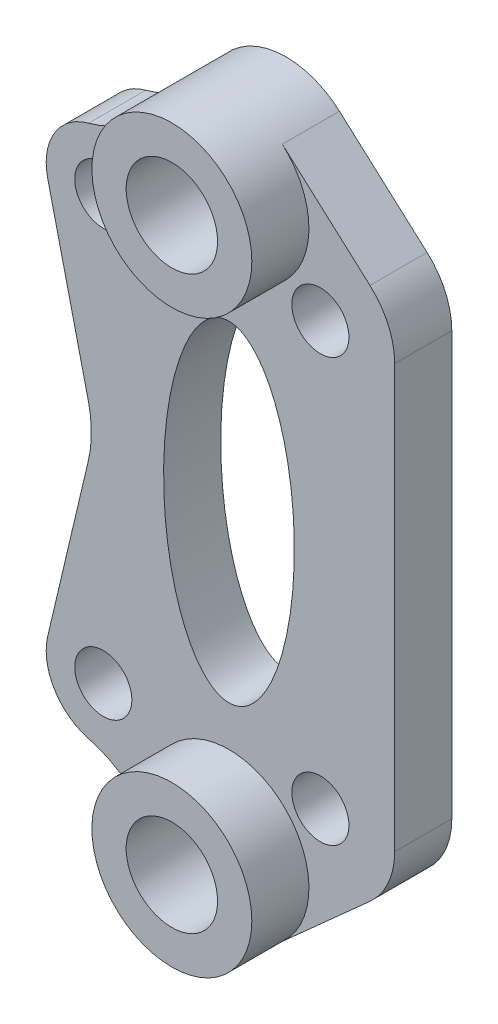
ISO-10303-21;
HEADER;
FILE_DESCRIPTION(('STEP AP214'),'2;1');
FILE_NAME('part.step','',(''),(''),'','','');
FILE_SCHEMA(('AUTOMOTIVE_DESIGN { 1 0 10303 214 1 1 1 1 }'));
ENDSEC;
DATA;
#1=APPLICATION_CONTEXT('core data for automotive mechanical design processes');
#2=APPLICATION_PROTOCOL_DEFINITION('international standard','automotive_design',2000,#1);
#3=PRODUCT_CONTEXT('',#1,'mechanical');
#4=PRODUCT('Part','Part','',(#3));
#5=PRODUCT_RELATED_PRODUCT_CATEGORY('part','',(#4));
#6=PRODUCT_DEFINITION_FORMATION('','',#4);
#7=PRODUCT_DEFINITION_CONTEXT('part definition',#1,'design');
#8=PRODUCT_DEFINITION('design','',#6,#7);
#9=PRODUCT_DEFINITION_SHAPE('','',#8);
#10=(LENGTH_UNIT() NAMED_UNIT(*) SI_UNIT(.MILLI.,.METRE.));
#11=(NAMED_UNIT(*) PLANE_ANGLE_UNIT() SI_UNIT($,.RADIAN.));
#12=(NAMED_UNIT(*) SI_UNIT($,.STERADIAN.) SOLID_ANGLE_UNIT());
#13=UNCERTAINTY_MEASURE_WITH_UNIT(LENGTH_MEASURE(1.E-05),#10,'distance_accuracy_value','');
#14=(GEOMETRIC_REPRESENTATION_CONTEXT(3) GLOBAL_UNCERTAINTY_ASSIGNED_CONTEXT((#13)) GLOBAL_UNIT_ASSIGNED_CONTEXT((#10,
#11,#12)) REPRESENTATION_CONTEXT('',''));
#15=CARTESIAN_POINT('',(0.,0.,0.));
#16=DIRECTION('',(0.,0.,1.));
#17=DIRECTION('',(1.,0.,0.));
#18=AXIS2_PLACEMENT_3D('',#15,#16,#17);
#19=CARTESIAN_POINT('',(8.00000000000001,-18.5,5.));
#20=DIRECTION('',(0.,0.,-1.));
#21=DIRECTION('',(-1.,0.,0.));
#22=AXIS2_PLACEMENT_3D('',#19,#20,#21);
#23=CYLINDRICAL_SURFACE('',#22,6.50512641556794);
#24=CARTESIAN_POINT('',(8.00000000000001,-18.5,0.));
#25=DIRECTION('',(0.,0.,1.));
#26=DIRECTION('',(1.,0.,0.));
#27=AXIS2_PLACEMENT_3D('',#24,#25,#26);
#28=CIRCLE('',#27,6.50512641556794);
#29=CARTESIAN_POINT('',(12.3397424562421,-23.3459576036125,0.));
#30=VERTEX_POINT('',#29);
#31=CARTESIAN_POINT('',(14.5051264155679,-18.5,0.));
#32=VERTEX_POINT('',#31);
#33=EDGE_CURVE('E247',#30,#32,#28,.T.);
#34=ORIENTED_EDGE('',*,*,#33,.T.);
#35=DIRECTION('',(0.,0.,-1.));
#36=VECTOR('',#35,1.);
#37=CARTESIAN_POINT('',(14.5051264155679,-18.5,5.));
#38=LINE('',#37,#36);
#39=CARTESIAN_POINT('',(14.5051264155679,-18.5,5.));
#40=VERTEX_POINT('',#39);
#41=EDGE_CURVE('E11',#40,#32,#38,.T.);
#42=ORIENTED_EDGE('',*,*,#41,.F.);
#43=CARTESIAN_POINT('',(8.00000000000001,-18.5,5.));
#44=DIRECTION('',(0.,0.,1.));
#45=DIRECTION('',(1.,0.,0.));
#46=AXIS2_PLACEMENT_3D('',#43,#44,#45);
#47=CIRCLE('',#46,6.50512641556794);
#48=CARTESIAN_POINT('',(12.3397424562421,-23.3459576036125,5.));
#49=VERTEX_POINT('',#48);
#50=EDGE_CURVE('E115',#49,#40,#47,.T.);
#51=ORIENTED_EDGE('',*,*,#50,.F.);
#52=DIRECTION('',(0.,0.,-1.));
#53=VECTOR('',#52,1.);
#54=CARTESIAN_POINT('',(12.3397424562421,-23.3459576036125,5.));
#55=LINE('',#54,#53);
#56=EDGE_CURVE('E301',#49,#30,#55,.T.);
#57=ORIENTED_EDGE('',*,*,#56,.T.);
#58=EDGE_LOOP('',(#34,#42,#51,#57));
#59=FACE_BOUND('',#58,.T.);
#60=ADVANCED_FACE('F41',(#59),#23,.T.);
#61=CARTESIAN_POINT('',(14.5051264155679,0.,5.));
#62=DIRECTION('',(1.,0.,0.));
#63=DIRECTION('',(0.,1.,0.));
#64=AXIS2_PLACEMENT_3D('',#61,#62,#63);
#65=PLANE('',#64);
#66=DIRECTION('',(0.,-1.,0.));
#67=VECTOR('',#66,1.);
#68=CARTESIAN_POINT('',(14.5051264155679,0.,0.));
#69=LINE('',#68,#67);
#70=CARTESIAN_POINT('',(14.5051264155679,18.5,0.));
#71=VERTEX_POINT('',#70);
#72=EDGE_CURVE('E240',#71,#32,#69,.T.);
#73=ORIENTED_EDGE('',*,*,#72,.F.);
#74=DIRECTION('',(0.,0.,-1.));
#75=VECTOR('',#74,1.);
#76=CARTESIAN_POINT('',(14.5051264155679,18.5,5.));
#77=LINE('',#76,#75);
#78=CARTESIAN_POINT('',(14.5051264155679,18.5,5.));
#79=VERTEX_POINT('',#78);
#80=EDGE_CURVE('E49',#79,#71,#77,.T.);
#81=ORIENTED_EDGE('',*,*,#80,.F.);
#82=DIRECTION('',(0.,-1.,0.));
#83=VECTOR('',#82,1.);
#84=CARTESIAN_POINT('',(14.5051264155679,0.,5.));
#85=LINE('',#84,#83);
#86=EDGE_CURVE('E330',#79,#40,#85,.T.);
#87=ORIENTED_EDGE('',*,*,#86,.T.);
#88=ORIENTED_EDGE('',*,*,#41,.T.);
#89=EDGE_LOOP('',(#73,#81,#87,#88));
#90=FACE_BOUND('',#89,.T.);
#91=ADVANCED_FACE('F230',(#90),#65,.T.);
#92=CARTESIAN_POINT('',(8.00000000000001,18.5,5.));
#93=DIRECTION('',(0.,0.,-1.));
#94=DIRECTION('',(-1.,0.,0.));
#95=AXIS2_PLACEMENT_3D('',#92,#93,#94);
#96=CYLINDRICAL_SURFACE('',#95,6.50512641556794);
#97=CARTESIAN_POINT('',(8.00000000000001,18.5,0.));
#98=DIRECTION('',(0.,0.,1.));
#99=DIRECTION('',(1.,0.,0.));
#100=AXIS2_PLACEMENT_3D('',#97,#98,#99);
#101=CIRCLE('',#100,6.50512641556794);
#102=CARTESIAN_POINT('',(12.3397424562421,23.3459576036125,0.));
#103=VERTEX_POINT('',#102);
#104=EDGE_CURVE('E246',#103,#71,#101,.F.);
#105=ORIENTED_EDGE('',*,*,#104,.F.);
#106=DIRECTION('',(0.,0.,-1.));
#107=VECTOR('',#106,1.);
#108=CARTESIAN_POINT('',(12.3397424562421,23.3459576036125,5.));
#109=LINE('',#108,#107);
#110=CARTESIAN_POINT('',(12.3397424562421,23.3459576036125,5.));
#111=VERTEX_POINT('',#110);
#112=EDGE_CURVE('E324',#111,#103,#109,.T.);
#113=ORIENTED_EDGE('',*,*,#112,.F.);
#114=CARTESIAN_POINT('',(8.00000000000001,18.5,5.));
#115=DIRECTION('',(0.,0.,1.));
#116=DIRECTION('',(1.,0.,0.));
#117=AXIS2_PLACEMENT_3D('',#114,#115,#116);
#118=CIRCLE('',#117,6.50512641556794);
#119=EDGE_CURVE('E327',#111,#79,#118,.F.);
#120=ORIENTED_EDGE('',*,*,#119,.T.);
#121=ORIENTED_EDGE('',*,*,#80,.T.);
#122=EDGE_LOOP('',(#105,#113,#120,#121));
#123=FACE_BOUND('',#122,.T.);
#124=ADVANCED_FACE('F227',(#123),#96,.T.);
#125=CARTESIAN_POINT('',(17.0941904759462,19.088165518984,5.));
#126=DIRECTION('',(0.667126536673649,0.744944416762635,0.));
#127=DIRECTION('',(-0.744944416762635,0.667126536673649,0.));
#128=AXIS2_PLACEMENT_3D('',#125,#126,#127);
#129=PLANE('',#128);
#130=DIRECTION('',(0.744944416762635,-0.667126536673649,0.));
#131=VECTOR('',#130,1.);
#132=CARTESIAN_POINT('',(17.0941904759462,19.088165518984,0.));
#133=LINE('',#132,#131);
#134=CARTESIAN_POINT('',(4.66988575671554,30.2146109173385,0.));
#135=VERTEX_POINT('',#134);
#136=EDGE_CURVE('E256',#135,#103,#133,.T.);
#137=ORIENTED_EDGE('',*,*,#136,.F.);
#138=DIRECTION('',(0.,0.,-1.));
#139=VECTOR('',#138,1.);
#140=CARTESIAN_POINT('',(4.66988575671554,30.2146109173385,5.));
#141=LINE('',#140,#139);
#142=CARTESIAN_POINT('',(4.66988575671554,30.2146109173384,5.));
#143=VERTEX_POINT('',#142);
#144=EDGE_CURVE('E322',#143,#135,#141,.T.);
#145=ORIENTED_EDGE('',*,*,#144,.F.);
#146=DIRECTION('',(0.744944416762635,-0.667126536673649,0.));
#147=VECTOR('',#146,1.);
#148=CARTESIAN_POINT('',(17.0941904759462,19.088165518984,5.));
#149=LINE('',#148,#147);
#150=EDGE_CURVE('E329',#143,#111,#149,.T.);
#151=ORIENTED_EDGE('',*,*,#150,.T.);
#152=ORIENTED_EDGE('',*,*,#112,.T.);
#153=EDGE_LOOP('',(#137,#145,#151,#152));
#154=FACE_BOUND('',#153,.T.);
#155=ADVANCED_FACE('F223',(#154),#129,.T.);
#156=CARTESIAN_POINT('',(0.,25.,5.));
#157=DIRECTION('',(0.,0.,-1.));
#158=DIRECTION('',(-1.,0.,0.));
#159=AXIS2_PLACEMENT_3D('',#156,#157,#158);
#160=CYLINDRICAL_SURFACE('',#159,7.00000000000001);
#161=CARTESIAN_POINT('',(0.,25.,0.));
#162=DIRECTION('',(0.,0.,1.));
#163=DIRECTION('',(1.,0.,0.));
#164=AXIS2_PLACEMENT_3D('',#161,#162,#163);
#165=CIRCLE('',#164,7.00000000000001);
#166=CARTESIAN_POINT('',(-6.22382131138489,28.2037553408385,0.));
#167=VERTEX_POINT('',#166);
#168=EDGE_CURVE('E258',#135,#167,#165,.T.);
#169=ORIENTED_EDGE('',*,*,#168,.T.);
#170=DIRECTION('',(0.,0.,-1.));
#171=VECTOR('',#170,1.);
#172=CARTESIAN_POINT('',(-6.22382131138489,28.2037553408385,5.));
#173=LINE('',#172,#171);
#174=CARTESIAN_POINT('',(-6.22382131138489,28.2037553408385,5.));
#175=VERTEX_POINT('',#174);
#176=EDGE_CURVE('E319',#175,#167,#173,.T.);
#177=ORIENTED_EDGE('',*,*,#176,.F.);
#178=CARTESIAN_POINT('',(0.,25.,5.));
#179=DIRECTION('',(0.,0.,1.));
#180=DIRECTION('',(1.,0.,0.));
#181=AXIS2_PLACEMENT_3D('',#178,#179,#180);
#182=CIRCLE('',#181,7.00000000000001);
#183=EDGE_CURVE('E392',#143,#175,#182,.F.);
#184=ORIENTED_EDGE('',*,*,#183,.F.);
#185=ORIENTED_EDGE('',*,*,#144,.T.);
#186=EDGE_LOOP('',(#169,#177,#184,#185));
#187=FACE_BOUND('',#186,.T.);
#188=CARTESIAN_POINT('',(0.,25.,10.));
#189=DIRECTION('',(0.,0.,1.));
#190=DIRECTION('',(1.,0.,0.));
#191=AXIS2_PLACEMENT_3D('',#188,#189,#190);
#192=CIRCLE('',#191,7.00000000000001);
#193=CARTESIAN_POINT('',(7.00000000000001,25.,10.));
#194=VERTEX_POINT('',#193);
#195=EDGE_CURVE('E389',#194,#194,#192,.T.);
#196=ORIENTED_EDGE('',*,*,#195,.F.);
#197=EDGE_LOOP('',(#196));
#198=FACE_BOUND('',#197,.T.);
#199=ADVANCED_FACE('F219',(#187,#198),#160,.T.);
#200=CARTESIAN_POINT('',(-14.7326624931067,32.5837405647752,5.));
#201=DIRECTION('',(0.,0.,-1.));
#202=DIRECTION('',(-1.,0.,0.));
#203=AXIS2_PLACEMENT_3D('',#200,#201,#202);
#204=CYLINDRICAL_SURFACE('',#203,9.56998687656718);
#205=CARTESIAN_POINT('',(-14.7326624931067,32.5837405647752,0.));
#206=DIRECTION('',(0.,0.,1.));
#207=DIRECTION('',(1.,0.,0.));
#208=AXIS2_PLACEMENT_3D('',#205,#206,#207);
#209=CIRCLE('',#208,9.56998687656718);
#210=CARTESIAN_POINT('',(-12.2809422975905,23.3331342656959,0.));
#211=VERTEX_POINT('',#210);
#212=EDGE_CURVE('E263',#167,#211,#209,.F.);
#213=ORIENTED_EDGE('',*,*,#212,.T.);
#214=DIRECTION('',(0.,0.,-1.));
#215=VECTOR('',#214,1.);
#216=CARTESIAN_POINT('',(-12.2809422975905,23.3331342656959,5.));
#217=LINE('',#216,#215);
#218=CARTESIAN_POINT('',(-12.2809422975905,23.3331342656959,5.));
#219=VERTEX_POINT('',#218);
#220=EDGE_CURVE('E316',#219,#211,#217,.T.);
#221=ORIENTED_EDGE('',*,*,#220,.F.);
#222=CARTESIAN_POINT('',(-14.7326624931067,32.5837405647752,5.));
#223=DIRECTION('',(0.,0.,1.));
#224=DIRECTION('',(1.,0.,0.));
#225=AXIS2_PLACEMENT_3D('',#222,#223,#224);
#226=CIRCLE('',#225,9.56998687656718);
#227=EDGE_CURVE('E332',#175,#219,#226,.F.);
#228=ORIENTED_EDGE('',*,*,#227,.F.);
#229=ORIENTED_EDGE('',*,*,#176,.T.);
#230=EDGE_LOOP('',(#213,#221,#228,#229));
#231=FACE_BOUND('',#230,.T.);
#232=ADVANCED_FACE('F215',(#231),#204,.F.);
#233=CARTESIAN_POINT('',(-11.,18.5,5.));
#234=DIRECTION('',(0.,0.,-1.));
#235=DIRECTION('',(-1.,0.,0.));
#236=AXIS2_PLACEMENT_3D('',#233,#234,#235);
#237=CYLINDRICAL_SURFACE('',#236,5.);
#238=CARTESIAN_POINT('',(-11.,18.5,0.));
#239=DIRECTION('',(0.,0.,1.));
#240=DIRECTION('',(1.,0.,0.));
#241=AXIS2_PLACEMENT_3D('',#238,#239,#240);
#242=CIRCLE('',#241,5.);
#243=CARTESIAN_POINT('',(-15.8665322945283,17.3524533010317,0.));
#244=VERTEX_POINT('',#243);
#245=EDGE_CURVE('E265',#211,#244,#242,.T.);
#246=ORIENTED_EDGE('',*,*,#245,.T.);
#247=DIRECTION('',(0.,0.,-1.));
#248=VECTOR('',#247,1.);
#249=CARTESIAN_POINT('',(-15.8665322945283,17.3524533010317,5.));
#250=LINE('',#249,#248);
#251=CARTESIAN_POINT('',(-15.8665322945283,17.3524533010317,5.));
#252=VERTEX_POINT('',#251);
#253=EDGE_CURVE('E313',#252,#244,#250,.T.);
#254=ORIENTED_EDGE('',*,*,#253,.F.);
#255=CARTESIAN_POINT('',(-11.,18.5,5.));
#256=DIRECTION('',(0.,0.,1.));
#257=DIRECTION('',(1.,0.,0.));
#258=AXIS2_PLACEMENT_3D('',#255,#256,#257);
#259=CIRCLE('',#258,5.);
#260=EDGE_CURVE('E338',#219,#252,#259,.T.);
#261=ORIENTED_EDGE('',*,*,#260,.F.);
#262=ORIENTED_EDGE('',*,*,#220,.T.);
#263=EDGE_LOOP('',(#246,#254,#261,#262));
#264=FACE_BOUND('',#263,.T.);
#265=ADVANCED_FACE('F211',(#264),#237,.T.);
#266=CARTESIAN_POINT('',(-11.1545283151441,-2.63027991430045,5.));
#267=DIRECTION('',(0.973306458905661,0.229509339793663,0.));
#268=DIRECTION('',(-0.229509339793663,0.973306458905661,0.));
#269=AXIS2_PLACEMENT_3D('',#266,#267,#268);
#270=PLANE('',#269);
#271=DIRECTION('',(0.229509339793663,-0.973306458905661,0.));
#272=VECTOR('',#271,1.);
#273=CARTESIAN_POINT('',(-11.1545283151441,-2.63027991430045,0.));
#274=LINE('',#273,#272);
#275=CARTESIAN_POINT('',(-12.3159499483673,2.29509339793663,0.));
#276=VERTEX_POINT('',#275);
#277=EDGE_CURVE('E267',#244,#276,#274,.T.);
#278=ORIENTED_EDGE('',*,*,#277,.T.);
#279=DIRECTION('',(0.,0.,-1.));
#280=VECTOR('',#279,1.);
#281=CARTESIAN_POINT('',(-12.3159499483673,2.29509339793663,5.));
#282=LINE('',#281,#280);
#283=CARTESIAN_POINT('',(-12.3159499483673,2.29509339793663,5.));
#284=VERTEX_POINT('',#283);
#285=EDGE_CURVE('E310',#284,#276,#282,.T.);
#286=ORIENTED_EDGE('',*,*,#285,.F.);
#287=DIRECTION('',(0.229509339793663,-0.973306458905661,0.));
#288=VECTOR('',#287,1.);
#289=CARTESIAN_POINT('',(-11.1545283151441,-2.63027991430045,5.));
#290=LINE('',#289,#288);
#291=EDGE_CURVE('E340',#252,#284,#290,.T.);
#292=ORIENTED_EDGE('',*,*,#291,.F.);
#293=ORIENTED_EDGE('',*,*,#253,.T.);
#294=EDGE_LOOP('',(#278,#286,#292,#293));
#295=FACE_BOUND('',#294,.T.);
#296=ADVANCED_FACE('F207',(#295),#270,.F.);
#297=CARTESIAN_POINT('',(-22.0490145374239,0.,5.));
#298=DIRECTION('',(0.,0.,-1.));
#299=DIRECTION('',(-1.,0.,0.));
#300=AXIS2_PLACEMENT_3D('',#297,#298,#299);
#301=CYLINDRICAL_SURFACE('',#300,10.);
#302=CARTESIAN_POINT('',(-22.0490145374239,0.,0.));
#303=DIRECTION('',(0.,0.,1.));
#304=DIRECTION('',(1.,0.,0.));
#305=AXIS2_PLACEMENT_3D('',#302,#303,#304);
#306=CIRCLE('',#305,10.);
#307=CARTESIAN_POINT('',(-12.3159499483673,-2.29509339793663,0.));
#308=VERTEX_POINT('',#307);
#309=EDGE_CURVE('E269',#276,#308,#306,.F.);
#310=ORIENTED_EDGE('',*,*,#309,.T.);
#311=DIRECTION('',(0.,0.,-1.));
#312=VECTOR('',#311,1.);
#313=CARTESIAN_POINT('',(-12.3159499483673,-2.29509339793663,5.));
#314=LINE('',#313,#312);
#315=CARTESIAN_POINT('',(-12.3159499483673,-2.29509339793663,5.));
#316=VERTEX_POINT('',#315);
#317=EDGE_CURVE('E308',#316,#308,#314,.T.);
#318=ORIENTED_EDGE('',*,*,#317,.F.);
#319=CARTESIAN_POINT('',(-22.0490145374239,0.,5.));
#320=DIRECTION('',(0.,0.,1.));
#321=DIRECTION('',(1.,0.,0.));
#322=AXIS2_PLACEMENT_3D('',#319,#320,#321);
#323=CIRCLE('',#322,10.);
#324=EDGE_CURVE('E342',#284,#316,#323,.F.);
#325=ORIENTED_EDGE('',*,*,#324,.F.);
#326=ORIENTED_EDGE('',*,*,#285,.T.);
#327=EDGE_LOOP('',(#310,#318,#325,#326));
#328=FACE_BOUND('',#327,.T.);
#329=ADVANCED_FACE('F203',(#328),#301,.F.);
#330=CARTESIAN_POINT('',(-11.1545283151441,2.63027991430045,5.));
#331=DIRECTION('',(-0.973306458905661,0.229509339793663,0.));
#332=DIRECTION('',(-0.229509339793663,-0.973306458905661,0.));
#333=AXIS2_PLACEMENT_3D('',#330,#331,#332);
#334=PLANE('',#333);
#335=DIRECTION('',(0.229509339793663,0.973306458905661,0.));
#336=VECTOR('',#335,1.);
#337=CARTESIAN_POINT('',(-11.1545283151441,2.63027991430045,0.));
#338=LINE('',#337,#336);
#339=CARTESIAN_POINT('',(-15.8665322945283,-17.3524533010317,0.));
#340=VERTEX_POINT('',#339);
#341=EDGE_CURVE('E272',#340,#308,#338,.T.);
#342=ORIENTED_EDGE('',*,*,#341,.F.);
#343=DIRECTION('',(0.,0.,-1.));
#344=VECTOR('',#343,1.);
#345=CARTESIAN_POINT('',(-15.8665322945283,-17.3524533010317,5.));
#346=LINE('',#345,#344);
#347=CARTESIAN_POINT('',(-15.8665322945283,-17.3524533010317,5.));
#348=VERTEX_POINT('',#347);
#349=EDGE_CURVE('E156',#348,#340,#346,.T.);
#350=ORIENTED_EDGE('',*,*,#349,.F.);
#351=DIRECTION('',(0.229509339793663,0.973306458905661,0.));
#352=VECTOR('',#351,1.);
#353=CARTESIAN_POINT('',(-11.1545283151441,2.63027991430045,5.));
#354=LINE('',#353,#352);
#355=EDGE_CURVE('E166',#348,#316,#354,.T.);
#356=ORIENTED_EDGE('',*,*,#355,.T.);
#357=ORIENTED_EDGE('',*,*,#317,.T.);
#358=EDGE_LOOP('',(#342,#350,#356,#357));
#359=FACE_BOUND('',#358,.T.);
#360=ADVANCED_FACE('F200',(#359),#334,.T.);
#361=CARTESIAN_POINT('',(-11.,-18.5,5.));
#362=DIRECTION('',(0.,0.,-1.));
#363=DIRECTION('',(-1.,0.,0.));
#364=AXIS2_PLACEMENT_3D('',#361,#362,#363);
#365=CYLINDRICAL_SURFACE('',#364,5.);
#366=CARTESIAN_POINT('',(-11.,-18.5,0.));
#367=DIRECTION('',(0.,0.,1.));
#368=DIRECTION('',(1.,0.,0.));
#369=AXIS2_PLACEMENT_3D('',#366,#367,#368);
#370=CIRCLE('',#369,5.);
#371=CARTESIAN_POINT('',(-12.2809422975905,-23.3331342656959,0.));
#372=VERTEX_POINT('',#371);
#373=EDGE_CURVE('E151',#372,#340,#370,.F.);
#374=ORIENTED_EDGE('',*,*,#373,.F.);
#375=DIRECTION('',(0.,0.,-1.));
#376=VECTOR('',#375,1.);
#377=CARTESIAN_POINT('',(-12.2809422975905,-23.3331342656959,5.));
#378=LINE('',#377,#376);
#379=CARTESIAN_POINT('',(-12.2809422975905,-23.3331342656959,5.));
#380=VERTEX_POINT('',#379);
#381=EDGE_CURVE('E146',#380,#372,#378,.T.);
#382=ORIENTED_EDGE('',*,*,#381,.F.);
#383=CARTESIAN_POINT('',(-11.,-18.5,5.));
#384=DIRECTION('',(0.,0.,1.));
#385=DIRECTION('',(1.,0.,0.));
#386=AXIS2_PLACEMENT_3D('',#383,#384,#385);
#387=CIRCLE('',#386,5.);
#388=EDGE_CURVE('E149',#380,#348,#387,.F.);
#389=ORIENTED_EDGE('',*,*,#388,.T.);
#390=ORIENTED_EDGE('',*,*,#349,.T.);
#391=EDGE_LOOP('',(#374,#382,#389,#390));
#392=FACE_BOUND('',#391,.T.);
#393=ADVANCED_FACE('F148',(#392),#365,.T.);
#394=CARTESIAN_POINT('',(-14.7326624931067,-32.5837405647752,5.));
#395=DIRECTION('',(0.,0.,-1.));
#396=DIRECTION('',(-1.,0.,0.));
#397=AXIS2_PLACEMENT_3D('',#394,#395,#396);
#398=CYLINDRICAL_SURFACE('',#397,9.56998687656718);
#399=CARTESIAN_POINT('',(-14.7326624931067,-32.5837405647752,0.));
#400=DIRECTION('',(0.,0.,1.));
#401=DIRECTION('',(1.,0.,0.));
#402=AXIS2_PLACEMENT_3D('',#399,#400,#401);
#403=CIRCLE('',#402,9.56998687656718);
#404=CARTESIAN_POINT('',(-6.22382131138489,-28.2037553408385,0.));
#405=VERTEX_POINT('',#404);
#406=EDGE_CURVE('E276',#405,#372,#403,.T.);
#407=ORIENTED_EDGE('',*,*,#406,.F.);
#408=DIRECTION('',(0.,0.,-1.));
#409=VECTOR('',#408,1.);
#410=CARTESIAN_POINT('',(-6.22382131138489,-28.2037553408385,5.));
#411=LINE('',#410,#409);
#412=CARTESIAN_POINT('',(-6.22382131138488,-28.2037553408385,5.));
#413=VERTEX_POINT('',#412);
#414=EDGE_CURVE('E157',#413,#405,#411,.T.);
#415=ORIENTED_EDGE('',*,*,#414,.F.);
#416=CARTESIAN_POINT('',(-14.7326624931067,-32.5837405647752,5.));
#417=DIRECTION('',(0.,0.,1.));
#418=DIRECTION('',(1.,0.,0.));
#419=AXIS2_PLACEMENT_3D('',#416,#417,#418);
#420=CIRCLE('',#419,9.56998687656718);
#421=EDGE_CURVE('E164',#413,#380,#420,.T.);
#422=ORIENTED_EDGE('',*,*,#421,.T.);
#423=ORIENTED_EDGE('',*,*,#381,.T.);
#424=EDGE_LOOP('',(#407,#415,#422,#423));
#425=FACE_BOUND('',#424,.T.);
#426=ADVANCED_FACE('F169',(#425),#398,.F.);
#427=CARTESIAN_POINT('',(0.,-25.,5.));
#428=DIRECTION('',(0.,0.,-1.));
#429=DIRECTION('',(-1.,0.,0.));
#430=AXIS2_PLACEMENT_3D('',#427,#428,#429);
#431=CYLINDRICAL_SURFACE('',#430,7.00000000000001);
#432=CARTESIAN_POINT('',(0.,-25.,0.));
#433=DIRECTION('',(0.,0.,1.));
#434=DIRECTION('',(1.,0.,0.));
#435=AXIS2_PLACEMENT_3D('',#432,#433,#434);
#436=CIRCLE('',#435,7.00000000000001);
#437=CARTESIAN_POINT('',(4.66988575671554,-30.2146109173385,0.));
#438=VERTEX_POINT('',#437);
#439=EDGE_CURVE('E103',#405,#438,#436,.T.);
#440=ORIENTED_EDGE('',*,*,#439,.T.);
#441=DIRECTION('',(0.,0.,-1.));
#442=VECTOR('',#441,1.);
#443=CARTESIAN_POINT('',(4.66988575671554,-30.2146109173385,5.));
#444=LINE('',#443,#442);
#445=CARTESIAN_POINT('',(4.66988575671554,-30.2146109173385,5.));
#446=VERTEX_POINT('',#445);
#447=EDGE_CURVE('E303',#446,#438,#444,.T.);
#448=ORIENTED_EDGE('',*,*,#447,.F.);
#449=CARTESIAN_POINT('',(0.,-25.,5.));
#450=DIRECTION('',(0.,0.,1.));
#451=DIRECTION('',(1.,0.,0.));
#452=AXIS2_PLACEMENT_3D('',#449,#450,#451);
#453=CIRCLE('',#452,7.00000000000001);
#454=EDGE_CURVE('E346',#413,#446,#453,.F.);
#455=ORIENTED_EDGE('',*,*,#454,.F.);
#456=ORIENTED_EDGE('',*,*,#414,.T.);
#457=EDGE_LOOP('',(#440,#448,#455,#456));
#458=FACE_BOUND('',#457,.T.);
#459=CARTESIAN_POINT('',(0.,-25.,10.));
#460=DIRECTION('',(0.,0.,1.));
#461=DIRECTION('',(1.,0.,0.));
#462=AXIS2_PLACEMENT_3D('',#459,#460,#461);
#463=CIRCLE('',#462,7.00000000000001);
#464=CARTESIAN_POINT('',(7.,-25.,10.));
#465=VERTEX_POINT('',#464);
#466=EDGE_CURVE('E347',#465,#465,#463,.T.);
#467=ORIENTED_EDGE('',*,*,#466,.F.);
#468=EDGE_LOOP('',(#467));
#469=FACE_BOUND('',#468,.T.);
#470=ADVANCED_FACE('F192',(#458,#469),#431,.T.);
#471=CARTESIAN_POINT('',(0.,-25.,5.));
#472=DIRECTION('',(0.,0.,-1.));
#473=DIRECTION('',(-1.,0.,0.));
#474=AXIS2_PLACEMENT_3D('',#471,#472,#473);
#475=CYLINDRICAL_SURFACE('',#474,4.);
#476=CARTESIAN_POINT('',(0.,-25.,0.));
#477=DIRECTION('',(0.,0.,1.));
#478=DIRECTION('',(1.,0.,0.));
#479=AXIS2_PLACEMENT_3D('',#476,#477,#478);
#480=CIRCLE('',#479,4.);
#481=CARTESIAN_POINT('',(4.,-25.,0.));
#482=VERTEX_POINT('',#481);
#483=EDGE_CURVE('E295',#482,#482,#480,.T.);
#484=ORIENTED_EDGE('',*,*,#483,.F.);
#485=EDGE_LOOP('',(#484));
#486=FACE_BOUND('',#485,.T.);
#487=CARTESIAN_POINT('',(0.,-25.,10.));
#488=DIRECTION('',(0.,0.,1.));
#489=DIRECTION('',(1.,0.,0.));
#490=AXIS2_PLACEMENT_3D('',#487,#488,#489);
#491=CIRCLE('',#490,4.);
#492=CARTESIAN_POINT('',(4.,-25.,10.));
#493=VERTEX_POINT('',#492);
#494=EDGE_CURVE('E396',#493,#493,#491,.T.);
#495=ORIENTED_EDGE('',*,*,#494,.T.);
#496=EDGE_LOOP('',(#495));
#497=FACE_BOUND('',#496,.T.);
#498=ADVANCED_FACE('F195',(#486,#497),#475,.F.);
#499=CARTESIAN_POINT('',(-11.,-18.5,5.));
#500=DIRECTION('',(0.,0.,-1.));
#501=DIRECTION('',(-1.,0.,0.));
#502=AXIS2_PLACEMENT_3D('',#499,#500,#501);
#503=CYLINDRICAL_SURFACE('',#502,2.5);
#504=CARTESIAN_POINT('',(-11.,-18.5,5.));
#505=DIRECTION('',(0.,0.,1.));
#506=DIRECTION('',(1.,0.,0.));
#507=AXIS2_PLACEMENT_3D('',#504,#505,#506);
#508=CIRCLE('',#507,2.5);
#509=CARTESIAN_POINT('',(-8.49999999999999,-18.5,5.));
#510=VERTEX_POINT('',#509);
#511=EDGE_CURVE('E304',#510,#510,#508,.F.);
#512=ORIENTED_EDGE('',*,*,#511,.F.);
#513=EDGE_LOOP('',(#512));
#514=FACE_BOUND('',#513,.T.);
#515=CARTESIAN_POINT('',(-11.,-18.5,0.));
#516=DIRECTION('',(0.,0.,1.));
#517=DIRECTION('',(1.,0.,0.));
#518=AXIS2_PLACEMENT_3D('',#515,#516,#517);
#519=CIRCLE('',#518,2.5);
#520=CARTESIAN_POINT('',(-8.49999999999999,-18.5,0.));
#521=VERTEX_POINT('',#520);
#522=EDGE_CURVE('E292',#521,#521,#519,.F.);
#523=ORIENTED_EDGE('',*,*,#522,.T.);
#524=EDGE_LOOP('',(#523));
#525=FACE_BOUND('',#524,.T.);
#526=ADVANCED_FACE('F417',(#514,#525),#503,.F.);
#527=CARTESIAN_POINT('',(8.00000000000001,18.5,5.));
#528=DIRECTION('',(0.,0.,-1.));
#529=DIRECTION('',(-1.,0.,0.));
#530=AXIS2_PLACEMENT_3D('',#527,#528,#529);
#531=CYLINDRICAL_SURFACE('',#530,2.5);
#532=CARTESIAN_POINT('',(8.00000000000001,18.5,5.));
#533=DIRECTION('',(0.,0.,1.));
#534=DIRECTION('',(1.,0.,0.));
#535=AXIS2_PLACEMENT_3D('',#532,#533,#534);
#536=CIRCLE('',#535,2.5);
#537=CARTESIAN_POINT('',(10.5,18.5,5.));
#538=VERTEX_POINT('',#537);
#539=EDGE_CURVE('E352',#538,#538,#536,.T.);
#540=ORIENTED_EDGE('',*,*,#539,.T.);
#541=EDGE_LOOP('',(#540));
#542=FACE_BOUND('',#541,.T.);
#543=CARTESIAN_POINT('',(8.00000000000001,18.5,0.));
#544=DIRECTION('',(0.,0.,1.));
#545=DIRECTION('',(1.,0.,0.));
#546=AXIS2_PLACEMENT_3D('',#543,#544,#545);
#547=CIRCLE('',#546,2.5);
#548=CARTESIAN_POINT('',(10.5,18.5,0.));
#549=VERTEX_POINT('',#548);
#550=EDGE_CURVE('E289',#549,#549,#547,.T.);
#551=ORIENTED_EDGE('',*,*,#550,.F.);
#552=EDGE_LOOP('',(#551));
#553=FACE_BOUND('',#552,.T.);
#554=ADVANCED_FACE('F421',(#542,#553),#531,.F.);
#555=CARTESIAN_POINT('',(-11.,18.5,5.));
#556=DIRECTION('',(0.,0.,-1.));
#557=DIRECTION('',(-1.,0.,0.));
#558=AXIS2_PLACEMENT_3D('',#555,#556,#557);
#559=CYLINDRICAL_SURFACE('',#558,2.5);
#560=CARTESIAN_POINT('',(-11.,18.5,5.));
#561=DIRECTION('',(0.,0.,1.));
#562=DIRECTION('',(1.,0.,0.));
#563=AXIS2_PLACEMENT_3D('',#560,#561,#562);
#564=CIRCLE('',#563,2.5);
#565=CARTESIAN_POINT('',(-8.49999999999999,18.5,5.));
#566=VERTEX_POINT('',#565);
#567=EDGE_CURVE('E354',#566,#566,#564,.T.);
#568=ORIENTED_EDGE('',*,*,#567,.T.);
#569=EDGE_LOOP('',(#568));
#570=FACE_BOUND('',#569,.T.);
#571=CARTESIAN_POINT('',(-11.,18.5,0.));
#572=DIRECTION('',(0.,0.,1.));
#573=DIRECTION('',(1.,0.,0.));
#574=AXIS2_PLACEMENT_3D('',#571,#572,#573);
#575=CIRCLE('',#574,2.5);
#576=CARTESIAN_POINT('',(-8.49999999999999,18.5,0.));
#577=VERTEX_POINT('',#576);
#578=EDGE_CURVE('E286',#577,#577,#575,.T.);
#579=ORIENTED_EDGE('',*,*,#578,.F.);
#580=EDGE_LOOP('',(#579));
#581=FACE_BOUND('',#580,.T.);
#582=ADVANCED_FACE('F365',(#570,#581),#559,.F.);
#583=CARTESIAN_POINT('',(8.00000000000001,-18.5,5.));
#584=DIRECTION('',(0.,0.,-1.));
#585=DIRECTION('',(-1.,0.,0.));
#586=AXIS2_PLACEMENT_3D('',#583,#584,#585);
#587=CYLINDRICAL_SURFACE('',#586,2.5);
#588=CARTESIAN_POINT('',(8.00000000000001,-18.5,5.));
#589=DIRECTION('',(0.,0.,1.));
#590=DIRECTION('',(1.,0.,0.));
#591=AXIS2_PLACEMENT_3D('',#588,#589,#590);
#592=CIRCLE('',#591,2.5);
#593=CARTESIAN_POINT('',(10.5,-18.5,5.));
#594=VERTEX_POINT('',#593);
#595=EDGE_CURVE('E178',#594,#594,#592,.F.);
#596=ORIENTED_EDGE('',*,*,#595,.F.);
#597=EDGE_LOOP('',(#596));
#598=FACE_BOUND('',#597,.T.);
#599=CARTESIAN_POINT('',(8.00000000000001,-18.5,0.));
#600=DIRECTION('',(0.,0.,1.));
#601=DIRECTION('',(1.,0.,0.));
#602=AXIS2_PLACEMENT_3D('',#599,#600,#601);
#603=CIRCLE('',#602,2.5);
#604=CARTESIAN_POINT('',(10.5,-18.5,0.));
#605=VERTEX_POINT('',#604);
#606=EDGE_CURVE('E283',#605,#605,#603,.F.);
#607=ORIENTED_EDGE('',*,*,#606,.T.);
#608=EDGE_LOOP('',(#607));
#609=FACE_BOUND('',#608,.T.);
#610=ADVANCED_FACE('F186',(#598,#609),#587,.F.);
#611=CARTESIAN_POINT('',(0.,0.,5.));
#612=DIRECTION('',(0.,0.,1.));
#613=DIRECTION('',(0.,1.,0.));
#614=AXIS2_PLACEMENT_3D('',#611,#612,#613);
#615=ELLIPSE('',#614,14.4668954141345,5.72191888869779);
#616=DIRECTION('',(0.,0.,-1.));
#617=VECTOR('',#616,1.);
#618=SURFACE_OF_LINEAR_EXTRUSION('',#615,#617);
#619=CARTESIAN_POINT('',(0.,14.4668954141345,5.));
#620=VERTEX_POINT('',#619);
#621=EDGE_CURVE('E171',#620,#620,#615,.T.);
#622=ORIENTED_EDGE('',*,*,#621,.T.);
#623=EDGE_LOOP('',(#622));
#624=FACE_BOUND('',#623,.T.);
#625=CARTESIAN_POINT('',(0.,0.,0.));
#626=DIRECTION('',(0.,0.,1.));
#627=DIRECTION('',(0.,1.,0.));
#628=AXIS2_PLACEMENT_3D('',#625,#626,#627);
#629=ELLIPSE('',#628,14.4668954141345,5.72191888869779);
#630=CARTESIAN_POINT('',(0.,14.4668954141345,0.));
#631=VERTEX_POINT('',#630);
#632=EDGE_CURVE('E280',#631,#631,#629,.T.);
#633=ORIENTED_EDGE('',*,*,#632,.F.);
#634=EDGE_LOOP('',(#633));
#635=FACE_BOUND('',#634,.T.);
#636=ADVANCED_FACE('F181',(#624,#635),#618,.T.);
#637=CARTESIAN_POINT('',(17.0941904759462,-19.088165518984,5.));
#638=DIRECTION('',(-0.667126536673649,0.744944416762635,0.));
#639=DIRECTION('',(-0.744944416762635,-0.667126536673649,0.));
#640=AXIS2_PLACEMENT_3D('',#637,#638,#639);
#641=PLANE('',#640);
#642=DIRECTION('',(0.744944416762635,0.667126536673649,0.));
#643=VECTOR('',#642,1.);
#644=CARTESIAN_POINT('',(17.0941904759462,-19.088165518984,0.));
#645=LINE('',#644,#643);
#646=EDGE_CURVE('E109',#438,#30,#645,.T.);
#647=ORIENTED_EDGE('',*,*,#646,.T.);
#648=ORIENTED_EDGE('',*,*,#56,.F.);
#649=DIRECTION('',(0.744944416762635,0.667126536673649,0.));
#650=VECTOR('',#649,1.);
#651=CARTESIAN_POINT('',(17.0941904759462,-19.088165518984,5.));
#652=LINE('',#651,#650);
#653=EDGE_CURVE('E57',#446,#49,#652,.T.);
#654=ORIENTED_EDGE('',*,*,#653,.F.);
#655=ORIENTED_EDGE('',*,*,#447,.T.);
#656=EDGE_LOOP('',(#647,#648,#654,#655));
#657=FACE_BOUND('',#656,.T.);
#658=ADVANCED_FACE('F185',(#657),#641,.F.);
#659=CARTESIAN_POINT('',(0.,25.,5.));
#660=DIRECTION('',(0.,0.,-1.));
#661=DIRECTION('',(-1.,0.,0.));
#662=AXIS2_PLACEMENT_3D('',#659,#660,#661);
#663=CYLINDRICAL_SURFACE('',#662,4.);
#664=CARTESIAN_POINT('',(0.,25.,0.));
#665=DIRECTION('',(0.,0.,1.));
#666=DIRECTION('',(1.,0.,0.));
#667=AXIS2_PLACEMENT_3D('',#664,#665,#666);
#668=CIRCLE('',#667,4.);
#669=CARTESIAN_POINT('',(4.,25.,0.));
#670=VERTEX_POINT('',#669);
#671=EDGE_CURVE('E298',#670,#670,#668,.T.);
#672=ORIENTED_EDGE('',*,*,#671,.F.);
#673=EDGE_LOOP('',(#672));
#674=FACE_BOUND('',#673,.T.);
#675=CARTESIAN_POINT('',(0.,25.,10.));
#676=DIRECTION('',(0.,0.,1.));
#677=DIRECTION('',(1.,0.,0.));
#678=AXIS2_PLACEMENT_3D('',#675,#676,#677);
#679=CIRCLE('',#678,4.);
#680=CARTESIAN_POINT('',(4.,25.,10.));
#681=VERTEX_POINT('',#680);
#682=EDGE_CURVE('E387',#681,#681,#679,.T.);
#683=ORIENTED_EDGE('',*,*,#682,.T.);
#684=EDGE_LOOP('',(#683));
#685=FACE_BOUND('',#684,.T.);
#686=ADVANCED_FACE('F191',(#674,#685),#663,.F.);
#687=CARTESIAN_POINT('',(0.,0.,5.));
#688=DIRECTION('',(0.,0.,1.));
#689=DIRECTION('',(1.,0.,0.));
#690=AXIS2_PLACEMENT_3D('',#687,#688,#689);
#691=PLANE('',#690);
#692=ORIENTED_EDGE('',*,*,#150,.F.);
#693=ORIENTED_EDGE('',*,*,#183,.T.);
#694=ORIENTED_EDGE('',*,*,#227,.T.);
#695=ORIENTED_EDGE('',*,*,#260,.T.);
#696=ORIENTED_EDGE('',*,*,#291,.T.);
#697=ORIENTED_EDGE('',*,*,#324,.T.);
#698=ORIENTED_EDGE('',*,*,#355,.F.);
#699=ORIENTED_EDGE('',*,*,#388,.F.);
#700=ORIENTED_EDGE('',*,*,#421,.F.);
#701=ORIENTED_EDGE('',*,*,#454,.T.);
#702=ORIENTED_EDGE('',*,*,#653,.T.);
#703=ORIENTED_EDGE('',*,*,#50,.T.);
#704=ORIENTED_EDGE('',*,*,#86,.F.);
#705=ORIENTED_EDGE('',*,*,#119,.F.);
#706=EDGE_LOOP('',(#692,#693,#694,#695,#696,#697,#698,#699,#700,#701,#702,#703,#704,#705));
#707=FACE_BOUND('',#706,.T.);
#708=ORIENTED_EDGE('',*,*,#621,.F.);
#709=EDGE_LOOP('',(#708));
#710=FACE_BOUND('',#709,.T.);
#711=ORIENTED_EDGE('',*,*,#595,.T.);
#712=EDGE_LOOP('',(#711));
#713=FACE_BOUND('',#712,.T.);
#714=ORIENTED_EDGE('',*,*,#567,.F.);
#715=EDGE_LOOP('',(#714));
#716=FACE_BOUND('',#715,.T.);
#717=ORIENTED_EDGE('',*,*,#539,.F.);
#718=EDGE_LOOP('',(#717));
#719=FACE_BOUND('',#718,.T.);
#720=ORIENTED_EDGE('',*,*,#511,.T.);
#721=EDGE_LOOP('',(#720));
#722=FACE_BOUND('',#721,.T.);
#723=ADVANCED_FACE('F162',(#707,#710,#713,#716,#719,#722),#691,.T.);
#724=CARTESIAN_POINT('',(0.,0.,0.));
#725=DIRECTION('',(0.,0.,1.));
#726=DIRECTION('',(1.,0.,0.));
#727=AXIS2_PLACEMENT_3D('',#724,#725,#726);
#728=PLANE('',#727);
#729=ORIENTED_EDGE('',*,*,#212,.F.);
#730=ORIENTED_EDGE('',*,*,#168,.F.);
#731=ORIENTED_EDGE('',*,*,#136,.T.);
#732=ORIENTED_EDGE('',*,*,#104,.T.);
#733=ORIENTED_EDGE('',*,*,#72,.T.);
#734=ORIENTED_EDGE('',*,*,#33,.F.);
#735=ORIENTED_EDGE('',*,*,#646,.F.);
#736=ORIENTED_EDGE('',*,*,#439,.F.);
#737=ORIENTED_EDGE('',*,*,#406,.T.);
#738=ORIENTED_EDGE('',*,*,#373,.T.);
#739=ORIENTED_EDGE('',*,*,#341,.T.);
#740=ORIENTED_EDGE('',*,*,#309,.F.);
#741=ORIENTED_EDGE('',*,*,#277,.F.);
#742=ORIENTED_EDGE('',*,*,#245,.F.);
#743=EDGE_LOOP('',(#729,#730,#731,#732,#733,#734,#735,#736,#737,#738,#739,#740,#741,#742));
#744=FACE_BOUND('',#743,.T.);
#745=ORIENTED_EDGE('',*,*,#632,.T.);
#746=EDGE_LOOP('',(#745));
#747=FACE_BOUND('',#746,.T.);
#748=ORIENTED_EDGE('',*,*,#606,.F.);
#749=EDGE_LOOP('',(#748));
#750=FACE_BOUND('',#749,.T.);
#751=ORIENTED_EDGE('',*,*,#578,.T.);
#752=EDGE_LOOP('',(#751));
#753=FACE_BOUND('',#752,.T.);
#754=ORIENTED_EDGE('',*,*,#550,.T.);
#755=EDGE_LOOP('',(#754));
#756=FACE_BOUND('',#755,.T.);
#757=ORIENTED_EDGE('',*,*,#522,.F.);
#758=EDGE_LOOP('',(#757));
#759=FACE_BOUND('',#758,.T.);
#760=ORIENTED_EDGE('',*,*,#483,.T.);
#761=EDGE_LOOP('',(#760));
#762=FACE_BOUND('',#761,.T.);
#763=ORIENTED_EDGE('',*,*,#671,.T.);
#764=EDGE_LOOP('',(#763));
#765=FACE_BOUND('',#764,.T.);
#766=ADVANCED_FACE('F252',(#744,#747,#750,#753,#756,#759,#762,#765),#728,.F.);
#767=CARTESIAN_POINT('',(0.,0.,10.));
#768=DIRECTION('',(0.,0.,1.));
#769=DIRECTION('',(1.,0.,0.));
#770=AXIS2_PLACEMENT_3D('',#767,#768,#769);
#771=PLANE('',#770);
#772=ORIENTED_EDGE('',*,*,#494,.F.);
#773=EDGE_LOOP('',(#772));
#774=FACE_BOUND('',#773,.T.);
#775=ORIENTED_EDGE('',*,*,#466,.T.);
#776=EDGE_LOOP('',(#775));
#777=FACE_BOUND('',#776,.T.);
#778=ADVANCED_FACE('F370',(#774,#777),#771,.T.);
#779=CARTESIAN_POINT('',(0.,0.,10.));
#780=DIRECTION('',(0.,0.,1.));
#781=DIRECTION('',(1.,0.,0.));
#782=AXIS2_PLACEMENT_3D('',#779,#780,#781);
#783=PLANE('',#782);
#784=ORIENTED_EDGE('',*,*,#682,.F.);
#785=EDGE_LOOP('',(#784));
#786=FACE_BOUND('',#785,.T.);
#787=ORIENTED_EDGE('',*,*,#195,.T.);
#788=EDGE_LOOP('',(#787));
#789=FACE_BOUND('',#788,.T.);
#790=ADVANCED_FACE('F404',(#786,#789),#783,.T.);
#791=CLOSED_SHELL('',(#60,#91,#124,#155,#199,#232,#265,#296,#329,#360,#393,#426,#470,#498,#526,
#554,#582,#610,#636,#658,#686,#723,#766,#778,#790));
#792=MANIFOLD_SOLID_BREP('B2',#791);
#793=ADVANCED_BREP_SHAPE_REPRESENTATION('',(#18,#792),#14);
#794=SHAPE_DEFINITION_REPRESENTATION(#9,#793);
ENDSEC;
END-ISO-10303-21;
